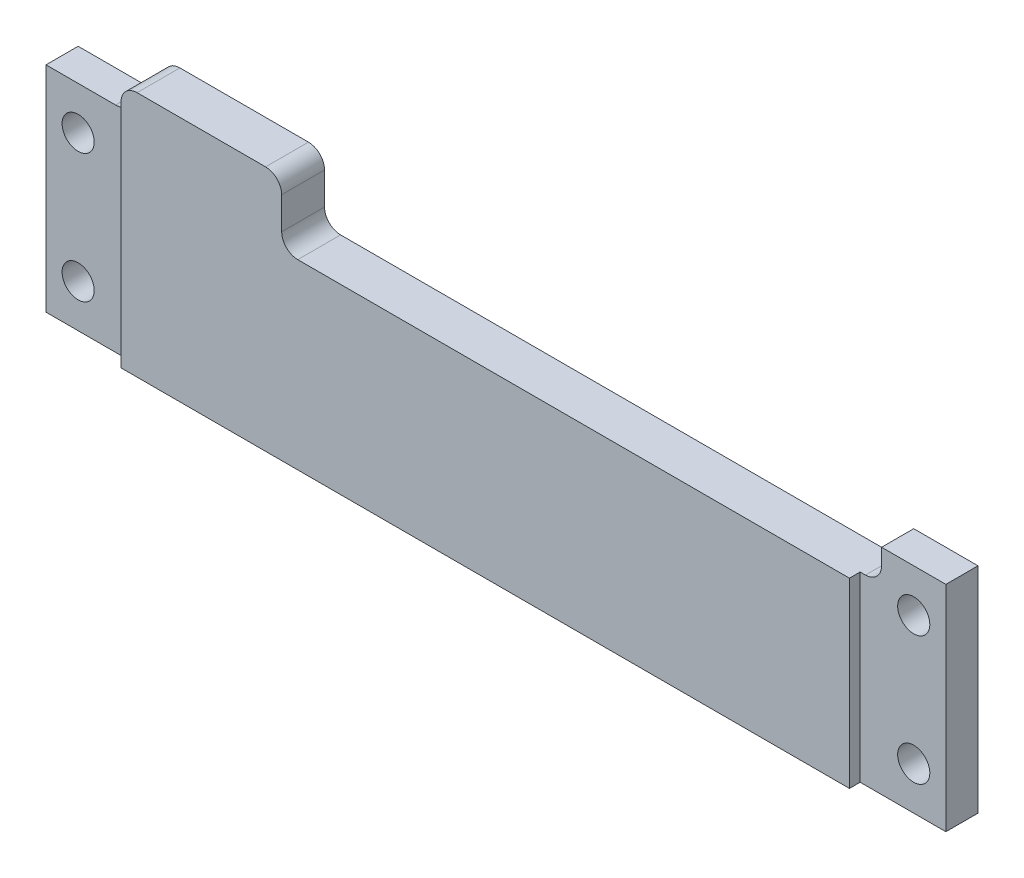
ISO-10303-21;
HEADER;
FILE_DESCRIPTION(('STEP AP214'),'2;1');
FILE_NAME('part.step','',(''),(''),'','','');
FILE_SCHEMA(('AUTOMOTIVE_DESIGN { 1 0 10303 214 1 1 1 1 }'));
ENDSEC;
DATA;
#1=APPLICATION_CONTEXT('core data for automotive mechanical design processes');
#2=APPLICATION_PROTOCOL_DEFINITION('international standard','automotive_design',2000,#1);
#3=PRODUCT_CONTEXT('',#1,'mechanical');
#4=PRODUCT('Part','Part','',(#3));
#5=PRODUCT_RELATED_PRODUCT_CATEGORY('part','',(#4));
#6=PRODUCT_DEFINITION_FORMATION('','',#4);
#7=PRODUCT_DEFINITION_CONTEXT('part definition',#1,'design');
#8=PRODUCT_DEFINITION('design','',#6,#7);
#9=PRODUCT_DEFINITION_SHAPE('','',#8);
#10=(LENGTH_UNIT() NAMED_UNIT(*) SI_UNIT(.MILLI.,.METRE.));
#11=(NAMED_UNIT(*) PLANE_ANGLE_UNIT() SI_UNIT($,.RADIAN.));
#12=(NAMED_UNIT(*) SI_UNIT($,.STERADIAN.) SOLID_ANGLE_UNIT());
#13=UNCERTAINTY_MEASURE_WITH_UNIT(LENGTH_MEASURE(1.E-05),#10,'distance_accuracy_value','');
#14=(GEOMETRIC_REPRESENTATION_CONTEXT(3) GLOBAL_UNCERTAINTY_ASSIGNED_CONTEXT((#13)) GLOBAL_UNIT_ASSIGNED_CONTEXT((#10,
#11,#12)) REPRESENTATION_CONTEXT('',''));
#15=CARTESIAN_POINT('',(0.,0.,0.));
#16=DIRECTION('',(0.,0.,1.));
#17=DIRECTION('',(1.,0.,0.));
#18=AXIS2_PLACEMENT_3D('',#15,#16,#17);
#19=CARTESIAN_POINT('',(0.,20.,4.));
#20=DIRECTION('',(1.,0.,0.));
#21=DIRECTION('',(0.,0.,-1.));
#22=AXIS2_PLACEMENT_3D('',#19,#20,#21);
#23=PLANE('',#22);
#24=DIRECTION('',(0.,-1.,0.));
#25=VECTOR('',#24,1.);
#26=CARTESIAN_POINT('',(0.,20.,3.));
#27=LINE('',#26,#25);
#28=CARTESIAN_POINT('',(0.,20.,3.));
#29=VERTEX_POINT('',#28);
#30=CARTESIAN_POINT('',(0.,0.,3.));
#31=VERTEX_POINT('',#30);
#32=EDGE_CURVE('E191',#29,#31,#27,.T.);
#33=ORIENTED_EDGE('',*,*,#32,.F.);
#34=DIRECTION('',(0.,0.,-1.));
#35=VECTOR('',#34,1.);
#36=CARTESIAN_POINT('',(0.,20.,4.));
#37=LINE('',#36,#35);
#38=CARTESIAN_POINT('',(0.,20.,0.));
#39=VERTEX_POINT('',#38);
#40=EDGE_CURVE('E232',#29,#39,#37,.T.);
#41=ORIENTED_EDGE('',*,*,#40,.T.);
#42=DIRECTION('',(0.,-1.,0.));
#43=VECTOR('',#42,1.);
#44=CARTESIAN_POINT('',(0.,20.,0.));
#45=LINE('',#44,#43);
#46=CARTESIAN_POINT('',(0.,0.,0.));
#47=VERTEX_POINT('',#46);
#48=EDGE_CURVE('E217',#39,#47,#45,.T.);
#49=ORIENTED_EDGE('',*,*,#48,.T.);
#50=DIRECTION('',(0.,0.,-1.));
#51=VECTOR('',#50,1.);
#52=CARTESIAN_POINT('',(0.,0.,4.));
#53=LINE('',#52,#51);
#54=EDGE_CURVE('E263',#31,#47,#53,.T.);
#55=ORIENTED_EDGE('',*,*,#54,.F.);
#56=EDGE_LOOP('',(#33,#41,#49,#55));
#57=FACE_BOUND('',#56,.T.);
#58=ADVANCED_FACE('F33',(#57),#23,.F.);
#59=CARTESIAN_POINT('',(8.,20.,4.));
#60=DIRECTION('',(0.,-1.,0.));
#61=DIRECTION('',(1.,0.,0.));
#62=AXIS2_PLACEMENT_3D('',#59,#60,#61);
#63=PLANE('',#62);
#64=DIRECTION('',(-1.,0.,0.));
#65=VECTOR('',#64,1.);
#66=CARTESIAN_POINT('',(0.,20.,3.));
#67=LINE('',#66,#65);
#68=CARTESIAN_POINT('',(6.5,20.,3.));
#69=VERTEX_POINT('',#68);
#70=EDGE_CURVE('E196',#69,#29,#67,.T.);
#71=ORIENTED_EDGE('',*,*,#70,.F.);
#72=DIRECTION('',(0.,0.,-1.));
#73=VECTOR('',#72,1.);
#74=CARTESIAN_POINT('',(6.5,20.,0.));
#75=LINE('',#74,#73);
#76=CARTESIAN_POINT('',(6.5,20.,0.));
#77=VERTEX_POINT('',#76);
#78=EDGE_CURVE('E299',#69,#77,#75,.T.);
#79=ORIENTED_EDGE('',*,*,#78,.T.);
#80=DIRECTION('',(-1.,0.,0.));
#81=VECTOR('',#80,1.);
#82=CARTESIAN_POINT('',(8.,20.,0.));
#83=LINE('',#82,#81);
#84=EDGE_CURVE('E221',#77,#39,#83,.T.);
#85=ORIENTED_EDGE('',*,*,#84,.T.);
#86=ORIENTED_EDGE('',*,*,#40,.F.);
#87=EDGE_LOOP('',(#71,#79,#85,#86));
#88=FACE_BOUND('',#87,.T.);
#89=ADVANCED_FACE('F375',(#88),#63,.F.);
#90=CARTESIAN_POINT('',(3.,4.,4.));
#91=DIRECTION('',(0.,0.,-1.));
#92=DIRECTION('',(-1.,0.,0.));
#93=AXIS2_PLACEMENT_3D('',#90,#91,#92);
#94=CYLINDRICAL_SURFACE('',#93,1.5);
#95=CARTESIAN_POINT('',(3.,4.,0.));
#96=DIRECTION('',(0.,0.,1.));
#97=DIRECTION('',(1.,0.,0.));
#98=AXIS2_PLACEMENT_3D('',#95,#96,#97);
#99=CIRCLE('',#98,1.5);
#100=CARTESIAN_POINT('',(4.5,4.,0.));
#101=VERTEX_POINT('',#100);
#102=EDGE_CURVE('E214',#101,#101,#99,.T.);
#103=ORIENTED_EDGE('',*,*,#102,.F.);
#104=EDGE_LOOP('',(#103));
#105=FACE_BOUND('',#104,.T.);
#106=CARTESIAN_POINT('',(3.,4.,3.));
#107=DIRECTION('',(0.,0.,1.));
#108=DIRECTION('',(1.,0.,0.));
#109=AXIS2_PLACEMENT_3D('',#106,#107,#108);
#110=CIRCLE('',#109,1.5);
#111=CARTESIAN_POINT('',(4.5,4.,3.));
#112=VERTEX_POINT('',#111);
#113=EDGE_CURVE('E202',#112,#112,#110,.T.);
#114=ORIENTED_EDGE('',*,*,#113,.T.);
#115=EDGE_LOOP('',(#114));
#116=FACE_BOUND('',#115,.T.);
#117=ADVANCED_FACE('F396',(#105,#116),#94,.F.);
#118=CARTESIAN_POINT('',(3.,16.,4.));
#119=DIRECTION('',(0.,0.,-1.));
#120=DIRECTION('',(-1.,0.,0.));
#121=AXIS2_PLACEMENT_3D('',#118,#119,#120);
#122=CYLINDRICAL_SURFACE('',#121,1.5);
#123=CARTESIAN_POINT('',(3.,16.,0.));
#124=DIRECTION('',(0.,0.,1.));
#125=DIRECTION('',(1.,0.,0.));
#126=AXIS2_PLACEMENT_3D('',#123,#124,#125);
#127=CIRCLE('',#126,1.5);
#128=CARTESIAN_POINT('',(4.5,16.,0.));
#129=VERTEX_POINT('',#128);
#130=EDGE_CURVE('E208',#129,#129,#127,.T.);
#131=ORIENTED_EDGE('',*,*,#130,.F.);
#132=EDGE_LOOP('',(#131));
#133=FACE_BOUND('',#132,.T.);
#134=CARTESIAN_POINT('',(3.,16.,3.));
#135=DIRECTION('',(0.,0.,1.));
#136=DIRECTION('',(1.,0.,0.));
#137=AXIS2_PLACEMENT_3D('',#134,#135,#136);
#138=CIRCLE('',#137,1.5);
#139=CARTESIAN_POINT('',(4.5,16.,3.));
#140=VERTEX_POINT('',#139);
#141=EDGE_CURVE('E201',#140,#140,#138,.T.);
#142=ORIENTED_EDGE('',*,*,#141,.T.);
#143=EDGE_LOOP('',(#142));
#144=FACE_BOUND('',#143,.T.);
#145=ADVANCED_FACE('F487',(#133,#144),#122,.F.);
#146=CARTESIAN_POINT('',(0.,0.,4.));
#147=DIRECTION('',(0.,0.,1.));
#148=DIRECTION('',(1.,0.,0.));
#149=AXIS2_PLACEMENT_3D('',#146,#147,#148);
#150=PLANE('',#149);
#151=DIRECTION('',(0.,1.,0.));
#152=VECTOR('',#151,1.);
#153=CARTESIAN_POINT('',(23.,23.,4.));
#154=LINE('',#153,#152);
#155=CARTESIAN_POINT('',(23.,18.5,4.));
#156=VERTEX_POINT('',#155);
#157=CARTESIAN_POINT('',(23.,21.5,4.));
#158=VERTEX_POINT('',#157);
#159=EDGE_CURVE('E224',#156,#158,#154,.T.);
#160=ORIENTED_EDGE('',*,*,#159,.T.);
#161=CARTESIAN_POINT('',(21.5,21.5,4.));
#162=DIRECTION('',(0.,0.,1.));
#163=DIRECTION('',(1.,0.,0.));
#164=AXIS2_PLACEMENT_3D('',#161,#162,#163);
#165=CIRCLE('',#164,1.5);
#166=CARTESIAN_POINT('',(21.5,23.,4.));
#167=VERTEX_POINT('',#166);
#168=EDGE_CURVE('E294',#158,#167,#165,.T.);
#169=ORIENTED_EDGE('',*,*,#168,.T.);
#170=DIRECTION('',(-1.,0.,0.));
#171=VECTOR('',#170,1.);
#172=CARTESIAN_POINT('',(23.,23.,4.));
#173=LINE('',#172,#171);
#174=CARTESIAN_POINT('',(9.5,23.,4.));
#175=VERTEX_POINT('',#174);
#176=EDGE_CURVE('E227',#167,#175,#173,.T.);
#177=ORIENTED_EDGE('',*,*,#176,.T.);
#178=CARTESIAN_POINT('',(9.5,21.5,4.));
#179=DIRECTION('',(0.,0.,1.));
#180=DIRECTION('',(1.,0.,0.));
#181=AXIS2_PLACEMENT_3D('',#178,#179,#180);
#182=CIRCLE('',#181,1.5);
#183=CARTESIAN_POINT('',(8.,21.5,4.));
#184=VERTEX_POINT('',#183);
#185=EDGE_CURVE('E292',#175,#184,#182,.T.);
#186=ORIENTED_EDGE('',*,*,#185,.T.);
#187=DIRECTION('',(0.,-1.,0.));
#188=VECTOR('',#187,1.);
#189=CARTESIAN_POINT('',(8.,23.,4.));
#190=LINE('',#189,#188);
#191=CARTESIAN_POINT('',(8.,0.,4.));
#192=VERTEX_POINT('',#191);
#193=EDGE_CURVE('E230',#184,#192,#190,.T.);
#194=ORIENTED_EDGE('',*,*,#193,.T.);
#195=DIRECTION('',(1.,0.,0.));
#196=VECTOR('',#195,1.);
#197=CARTESIAN_POINT('',(0.,0.,4.));
#198=LINE('',#197,#196);
#199=CARTESIAN_POINT('',(76.,0.,4.));
#200=VERTEX_POINT('',#199);
#201=EDGE_CURVE('E218',#192,#200,#198,.T.);
#202=ORIENTED_EDGE('',*,*,#201,.T.);
#203=DIRECTION('',(0.,-1.,0.));
#204=VECTOR('',#203,1.);
#205=CARTESIAN_POINT('',(76.,0.,4.));
#206=LINE('',#205,#204);
#207=CARTESIAN_POINT('',(76.,17.,4.));
#208=VERTEX_POINT('',#207);
#209=EDGE_CURVE('E162',#208,#200,#206,.T.);
#210=ORIENTED_EDGE('',*,*,#209,.F.);
#211=DIRECTION('',(-1.,0.,0.));
#212=VECTOR('',#211,1.);
#213=CARTESIAN_POINT('',(23.,17.,4.));
#214=LINE('',#213,#212);
#215=CARTESIAN_POINT('',(24.5,17.,4.));
#216=VERTEX_POINT('',#215);
#217=EDGE_CURVE('E220',#208,#216,#214,.T.);
#218=ORIENTED_EDGE('',*,*,#217,.T.);
#219=CARTESIAN_POINT('',(24.5,18.5,4.));
#220=DIRECTION('',(0.,0.,1.));
#221=DIRECTION('',(1.,0.,0.));
#222=AXIS2_PLACEMENT_3D('',#219,#220,#221);
#223=CIRCLE('',#222,1.5);
#224=EDGE_CURVE('E307',#216,#156,#223,.F.);
#225=ORIENTED_EDGE('',*,*,#224,.T.);
#226=EDGE_LOOP('',(#160,#169,#177,#186,#194,#202,#210,#218,#225));
#227=FACE_BOUND('',#226,.T.);
#228=ADVANCED_FACE('F330',(#227),#150,.T.);
#229=CARTESIAN_POINT('',(0.,0.,0.));
#230=DIRECTION('',(0.,0.,1.));
#231=DIRECTION('',(1.,0.,0.));
#232=AXIS2_PLACEMENT_3D('',#229,#230,#231);
#233=PLANE('',#232);
#234=ORIENTED_EDGE('',*,*,#130,.T.);
#235=EDGE_LOOP('',(#234));
#236=FACE_BOUND('',#235,.T.);
#237=ORIENTED_EDGE('',*,*,#102,.T.);
#238=EDGE_LOOP('',(#237));
#239=FACE_BOUND('',#238,.T.);
#240=DIRECTION('',(-1.,0.,0.));
#241=VECTOR('',#240,1.);
#242=CARTESIAN_POINT('',(23.,23.,0.));
#243=LINE('',#242,#241);
#244=CARTESIAN_POINT('',(21.5,23.,0.));
#245=VERTEX_POINT('',#244);
#246=CARTESIAN_POINT('',(9.5,23.,0.));
#247=VERTEX_POINT('',#246);
#248=EDGE_CURVE('E252',#245,#247,#243,.T.);
#249=ORIENTED_EDGE('',*,*,#248,.F.);
#250=CARTESIAN_POINT('',(21.5,21.5,0.));
#251=DIRECTION('',(0.,0.,1.));
#252=DIRECTION('',(1.,0.,0.));
#253=AXIS2_PLACEMENT_3D('',#250,#251,#252);
#254=CIRCLE('',#253,1.5);
#255=CARTESIAN_POINT('',(23.,21.5,0.));
#256=VERTEX_POINT('',#255);
#257=EDGE_CURVE('E290',#245,#256,#254,.F.);
#258=ORIENTED_EDGE('',*,*,#257,.T.);
#259=DIRECTION('',(0.,1.,0.));
#260=VECTOR('',#259,1.);
#261=CARTESIAN_POINT('',(23.,23.,0.));
#262=LINE('',#261,#260);
#263=CARTESIAN_POINT('',(23.,18.5,0.));
#264=VERTEX_POINT('',#263);
#265=EDGE_CURVE('E249',#264,#256,#262,.T.);
#266=ORIENTED_EDGE('',*,*,#265,.F.);
#267=CARTESIAN_POINT('',(24.5,18.5,0.));
#268=DIRECTION('',(0.,0.,1.));
#269=DIRECTION('',(1.,0.,0.));
#270=AXIS2_PLACEMENT_3D('',#267,#268,#269);
#271=CIRCLE('',#270,1.5);
#272=CARTESIAN_POINT('',(24.5,17.,0.));
#273=VERTEX_POINT('',#272);
#274=EDGE_CURVE('E305',#264,#273,#271,.T.);
#275=ORIENTED_EDGE('',*,*,#274,.T.);
#276=DIRECTION('',(-1.,0.,0.));
#277=VECTOR('',#276,1.);
#278=CARTESIAN_POINT('',(23.,17.,0.));
#279=LINE('',#278,#277);
#280=CARTESIAN_POINT('',(76.5,17.,0.));
#281=VERTEX_POINT('',#280);
#282=EDGE_CURVE('E246',#281,#273,#279,.T.);
#283=ORIENTED_EDGE('',*,*,#282,.F.);
#284=CARTESIAN_POINT('',(76.5,18.5,0.));
#285=DIRECTION('',(0.,0.,1.));
#286=DIRECTION('',(1.,0.,0.));
#287=AXIS2_PLACEMENT_3D('',#284,#285,#286);
#288=CIRCLE('',#287,1.5);
#289=CARTESIAN_POINT('',(78.,18.5,0.));
#290=VERTEX_POINT('',#289);
#291=EDGE_CURVE('E301',#281,#290,#288,.T.);
#292=ORIENTED_EDGE('',*,*,#291,.T.);
#293=DIRECTION('',(0.,-1.,0.));
#294=VECTOR('',#293,1.);
#295=CARTESIAN_POINT('',(78.,17.,0.));
#296=LINE('',#295,#294);
#297=CARTESIAN_POINT('',(78.,20.,0.));
#298=VERTEX_POINT('',#297);
#299=EDGE_CURVE('E243',#298,#290,#296,.T.);
#300=ORIENTED_EDGE('',*,*,#299,.F.);
#301=DIRECTION('',(-1.,0.,0.));
#302=VECTOR('',#301,1.);
#303=CARTESIAN_POINT('',(78.,20.,0.));
#304=LINE('',#303,#302);
#305=CARTESIAN_POINT('',(84.,20.,0.));
#306=VERTEX_POINT('',#305);
#307=EDGE_CURVE('E240',#306,#298,#304,.T.);
#308=ORIENTED_EDGE('',*,*,#307,.F.);
#309=DIRECTION('',(0.,1.,0.));
#310=VECTOR('',#309,1.);
#311=CARTESIAN_POINT('',(84.,0.,0.));
#312=LINE('',#311,#310);
#313=CARTESIAN_POINT('',(84.,0.,0.));
#314=VERTEX_POINT('',#313);
#315=EDGE_CURVE('E237',#314,#306,#312,.T.);
#316=ORIENTED_EDGE('',*,*,#315,.F.);
#317=DIRECTION('',(1.,0.,0.));
#318=VECTOR('',#317,1.);
#319=CARTESIAN_POINT('',(0.,0.,0.));
#320=LINE('',#319,#318);
#321=EDGE_CURVE('E235',#47,#314,#320,.T.);
#322=ORIENTED_EDGE('',*,*,#321,.F.);
#323=ORIENTED_EDGE('',*,*,#48,.F.);
#324=ORIENTED_EDGE('',*,*,#84,.F.);
#325=CARTESIAN_POINT('',(6.5,21.5,0.));
#326=DIRECTION('',(0.,0.,1.));
#327=DIRECTION('',(1.,0.,0.));
#328=AXIS2_PLACEMENT_3D('',#325,#326,#327);
#329=CIRCLE('',#328,1.5);
#330=CARTESIAN_POINT('',(8.,21.5,0.));
#331=VERTEX_POINT('',#330);
#332=EDGE_CURVE('E42',#77,#331,#329,.T.);
#333=ORIENTED_EDGE('',*,*,#332,.T.);
#334=CARTESIAN_POINT('',(9.5,21.5,0.));
#335=DIRECTION('',(0.,0.,1.));
#336=DIRECTION('',(1.,0.,0.));
#337=AXIS2_PLACEMENT_3D('',#334,#335,#336);
#338=CIRCLE('',#337,1.5);
#339=EDGE_CURVE('E288',#331,#247,#338,.F.);
#340=ORIENTED_EDGE('',*,*,#339,.T.);
#341=EDGE_LOOP('',(#249,#258,#266,#275,#283,#292,#300,#308,#316,#322,#323,#324,#333,#340));
#342=FACE_BOUND('',#341,.T.);
#343=CARTESIAN_POINT('',(81.,4.,0.));
#344=DIRECTION('',(0.,0.,1.));
#345=DIRECTION('',(1.,0.,0.));
#346=AXIS2_PLACEMENT_3D('',#343,#344,#345);
#347=CIRCLE('',#346,1.5);
#348=CARTESIAN_POINT('',(82.5,4.,0.));
#349=VERTEX_POINT('',#348);
#350=EDGE_CURVE('E211',#349,#349,#347,.T.);
#351=ORIENTED_EDGE('',*,*,#350,.T.);
#352=EDGE_LOOP('',(#351));
#353=FACE_BOUND('',#352,.T.);
#354=CARTESIAN_POINT('',(81.,16.,0.));
#355=DIRECTION('',(0.,0.,1.));
#356=DIRECTION('',(1.,0.,0.));
#357=AXIS2_PLACEMENT_3D('',#354,#355,#356);
#358=CIRCLE('',#357,1.5);
#359=CARTESIAN_POINT('',(82.5,16.,0.));
#360=VERTEX_POINT('',#359);
#361=EDGE_CURVE('E205',#360,#360,#358,.T.);
#362=ORIENTED_EDGE('',*,*,#361,.T.);
#363=EDGE_LOOP('',(#362));
#364=FACE_BOUND('',#363,.T.);
#365=ADVANCED_FACE('F314',(#236,#239,#342,#353,#364),#233,.F.);
#366=CARTESIAN_POINT('',(0.,0.,4.));
#367=DIRECTION('',(0.,1.,0.));
#368=DIRECTION('',(-1.,0.,0.));
#369=AXIS2_PLACEMENT_3D('',#366,#367,#368);
#370=PLANE('',#369);
#371=DIRECTION('',(1.,0.,0.));
#372=VECTOR('',#371,1.);
#373=CARTESIAN_POINT('',(76.,0.,3.));
#374=LINE('',#373,#372);
#375=CARTESIAN_POINT('',(76.,0.,3.));
#376=VERTEX_POINT('',#375);
#377=CARTESIAN_POINT('',(84.,0.,3.));
#378=VERTEX_POINT('',#377);
#379=EDGE_CURVE('E156',#376,#378,#374,.T.);
#380=ORIENTED_EDGE('',*,*,#379,.F.);
#381=DIRECTION('',(0.,0.,1.));
#382=VECTOR('',#381,1.);
#383=CARTESIAN_POINT('',(76.,0.,3.));
#384=LINE('',#383,#382);
#385=EDGE_CURVE('E165',#376,#200,#384,.T.);
#386=ORIENTED_EDGE('',*,*,#385,.T.);
#387=ORIENTED_EDGE('',*,*,#201,.F.);
#388=DIRECTION('',(0.,0.,1.));
#389=VECTOR('',#388,1.);
#390=CARTESIAN_POINT('',(8.,0.,3.));
#391=LINE('',#390,#389);
#392=CARTESIAN_POINT('',(8.,0.,3.));
#393=VERTEX_POINT('',#392);
#394=EDGE_CURVE('E198',#393,#192,#391,.T.);
#395=ORIENTED_EDGE('',*,*,#394,.F.);
#396=DIRECTION('',(1.,0.,0.));
#397=VECTOR('',#396,1.);
#398=CARTESIAN_POINT('',(0.,0.,3.));
#399=LINE('',#398,#397);
#400=EDGE_CURVE('E193',#31,#393,#399,.T.);
#401=ORIENTED_EDGE('',*,*,#400,.F.);
#402=ORIENTED_EDGE('',*,*,#54,.T.);
#403=ORIENTED_EDGE('',*,*,#321,.T.);
#404=DIRECTION('',(0.,0.,-1.));
#405=VECTOR('',#404,1.);
#406=CARTESIAN_POINT('',(84.,0.,4.));
#407=LINE('',#406,#405);
#408=EDGE_CURVE('E177',#378,#314,#407,.T.);
#409=ORIENTED_EDGE('',*,*,#408,.F.);
#410=EDGE_LOOP('',(#380,#386,#387,#395,#401,#402,#403,#409));
#411=FACE_BOUND('',#410,.T.);
#412=ADVANCED_FACE('F175',(#411),#370,.F.);
#413=CARTESIAN_POINT('',(84.,0.,4.));
#414=DIRECTION('',(-1.,0.,0.));
#415=DIRECTION('',(0.,0.,1.));
#416=AXIS2_PLACEMENT_3D('',#413,#414,#415);
#417=PLANE('',#416);
#418=DIRECTION('',(0.,0.,-1.));
#419=VECTOR('',#418,1.);
#420=CARTESIAN_POINT('',(84.,20.,4.));
#421=LINE('',#420,#419);
#422=CARTESIAN_POINT('',(84.,20.,3.));
#423=VERTEX_POINT('',#422);
#424=EDGE_CURVE('E260',#423,#306,#421,.T.);
#425=ORIENTED_EDGE('',*,*,#424,.F.);
#426=DIRECTION('',(0.,1.,0.));
#427=VECTOR('',#426,1.);
#428=CARTESIAN_POINT('',(84.,0.,3.));
#429=LINE('',#428,#427);
#430=EDGE_CURVE('E178',#378,#423,#429,.T.);
#431=ORIENTED_EDGE('',*,*,#430,.F.);
#432=ORIENTED_EDGE('',*,*,#408,.T.);
#433=ORIENTED_EDGE('',*,*,#315,.T.);
#434=EDGE_LOOP('',(#425,#431,#432,#433));
#435=FACE_BOUND('',#434,.T.);
#436=ADVANCED_FACE('F367',(#435),#417,.F.);
#437=CARTESIAN_POINT('',(78.,20.,4.));
#438=DIRECTION('',(0.,-1.,0.));
#439=DIRECTION('',(0.,0.,-1.));
#440=AXIS2_PLACEMENT_3D('',#437,#438,#439);
#441=PLANE('',#440);
#442=DIRECTION('',(0.,0.,-1.));
#443=VECTOR('',#442,1.);
#444=CARTESIAN_POINT('',(78.,20.,4.));
#445=LINE('',#444,#443);
#446=CARTESIAN_POINT('',(78.,20.,3.));
#447=VERTEX_POINT('',#446);
#448=EDGE_CURVE('E258',#447,#298,#445,.T.);
#449=ORIENTED_EDGE('',*,*,#448,.F.);
#450=DIRECTION('',(-1.,0.,0.));
#451=VECTOR('',#450,1.);
#452=CARTESIAN_POINT('',(76.,20.,3.));
#453=LINE('',#452,#451);
#454=EDGE_CURVE('E172',#423,#447,#453,.T.);
#455=ORIENTED_EDGE('',*,*,#454,.F.);
#456=ORIENTED_EDGE('',*,*,#424,.T.);
#457=ORIENTED_EDGE('',*,*,#307,.T.);
#458=EDGE_LOOP('',(#449,#455,#456,#457));
#459=FACE_BOUND('',#458,.T.);
#460=ADVANCED_FACE('F362',(#459),#441,.F.);
#461=CARTESIAN_POINT('',(78.,17.,4.));
#462=DIRECTION('',(1.,0.,0.));
#463=DIRECTION('',(0.,0.,-1.));
#464=AXIS2_PLACEMENT_3D('',#461,#462,#463);
#465=PLANE('',#464);
#466=ORIENTED_EDGE('',*,*,#299,.T.);
#467=DIRECTION('',(0.,0.,-1.));
#468=VECTOR('',#467,1.);
#469=CARTESIAN_POINT('',(78.,18.5,3.));
#470=LINE('',#469,#468);
#471=CARTESIAN_POINT('',(78.,18.5,3.));
#472=VERTEX_POINT('',#471);
#473=EDGE_CURVE('E276',#290,#472,#470,.F.);
#474=ORIENTED_EDGE('',*,*,#473,.T.);
#475=DIRECTION('',(0.,1.,0.));
#476=VECTOR('',#475,1.);
#477=CARTESIAN_POINT('',(78.,17.,3.));
#478=LINE('',#477,#476);
#479=EDGE_CURVE('E189',#472,#447,#478,.T.);
#480=ORIENTED_EDGE('',*,*,#479,.T.);
#481=ORIENTED_EDGE('',*,*,#448,.T.);
#482=EDGE_LOOP('',(#466,#474,#480,#481));
#483=FACE_BOUND('',#482,.T.);
#484=ADVANCED_FACE('F357',(#483),#465,.F.);
#485=CARTESIAN_POINT('',(23.,17.,4.));
#486=DIRECTION('',(0.,-1.,0.));
#487=DIRECTION('',(0.,0.,-1.));
#488=AXIS2_PLACEMENT_3D('',#485,#486,#487);
#489=PLANE('',#488);
#490=DIRECTION('',(1.,0.,0.));
#491=VECTOR('',#490,1.);
#492=CARTESIAN_POINT('',(23.,17.,3.));
#493=LINE('',#492,#491);
#494=CARTESIAN_POINT('',(76.,17.,3.));
#495=VERTEX_POINT('',#494);
#496=CARTESIAN_POINT('',(76.5,17.,3.));
#497=VERTEX_POINT('',#496);
#498=EDGE_CURVE('E159',#495,#497,#493,.T.);
#499=ORIENTED_EDGE('',*,*,#498,.T.);
#500=DIRECTION('',(0.,0.,-1.));
#501=VECTOR('',#500,1.);
#502=CARTESIAN_POINT('',(76.5,17.,0.));
#503=LINE('',#502,#501);
#504=EDGE_CURVE('E273',#497,#281,#503,.T.);
#505=ORIENTED_EDGE('',*,*,#504,.T.);
#506=ORIENTED_EDGE('',*,*,#282,.T.);
#507=DIRECTION('',(0.,0.,-1.));
#508=VECTOR('',#507,1.);
#509=CARTESIAN_POINT('',(24.5,17.,4.));
#510=LINE('',#509,#508);
#511=EDGE_CURVE('E271',#273,#216,#510,.F.);
#512=ORIENTED_EDGE('',*,*,#511,.T.);
#513=ORIENTED_EDGE('',*,*,#217,.F.);
#514=DIRECTION('',(0.,0.,-1.));
#515=VECTOR('',#514,1.);
#516=CARTESIAN_POINT('',(76.,17.,4.));
#517=LINE('',#516,#515);
#518=EDGE_CURVE('E265',#208,#495,#517,.T.);
#519=ORIENTED_EDGE('',*,*,#518,.T.);
#520=EDGE_LOOP('',(#499,#505,#506,#512,#513,#519));
#521=FACE_BOUND('',#520,.T.);
#522=ADVANCED_FACE('F347',(#521),#489,.F.);
#523=CARTESIAN_POINT('',(23.,23.,4.));
#524=DIRECTION('',(-1.,0.,0.));
#525=DIRECTION('',(0.,0.,1.));
#526=AXIS2_PLACEMENT_3D('',#523,#524,#525);
#527=PLANE('',#526);
#528=ORIENTED_EDGE('',*,*,#159,.F.);
#529=DIRECTION('',(0.,0.,-1.));
#530=VECTOR('',#529,1.);
#531=CARTESIAN_POINT('',(23.,18.5,0.));
#532=LINE('',#531,#530);
#533=EDGE_CURVE('E280',#156,#264,#532,.T.);
#534=ORIENTED_EDGE('',*,*,#533,.T.);
#535=ORIENTED_EDGE('',*,*,#265,.T.);
#536=DIRECTION('',(0.,0.,-1.));
#537=VECTOR('',#536,1.);
#538=CARTESIAN_POINT('',(23.,21.5,4.));
#539=LINE('',#538,#537);
#540=EDGE_CURVE('E278',#256,#158,#539,.F.);
#541=ORIENTED_EDGE('',*,*,#540,.T.);
#542=EDGE_LOOP('',(#528,#534,#535,#541));
#543=FACE_BOUND('',#542,.T.);
#544=ADVANCED_FACE('F339',(#543),#527,.F.);
#545=CARTESIAN_POINT('',(23.,23.,4.));
#546=DIRECTION('',(0.,-1.,0.));
#547=DIRECTION('',(1.,0.,0.));
#548=AXIS2_PLACEMENT_3D('',#545,#546,#547);
#549=PLANE('',#548);
#550=ORIENTED_EDGE('',*,*,#176,.F.);
#551=DIRECTION('',(0.,0.,-1.));
#552=VECTOR('',#551,1.);
#553=CARTESIAN_POINT('',(21.5,23.,4.));
#554=LINE('',#553,#552);
#555=EDGE_CURVE('E285',#167,#245,#554,.T.);
#556=ORIENTED_EDGE('',*,*,#555,.T.);
#557=ORIENTED_EDGE('',*,*,#248,.T.);
#558=DIRECTION('',(0.,0.,-1.));
#559=VECTOR('',#558,1.);
#560=CARTESIAN_POINT('',(9.5,23.,4.));
#561=LINE('',#560,#559);
#562=EDGE_CURVE('E283',#247,#175,#561,.F.);
#563=ORIENTED_EDGE('',*,*,#562,.T.);
#564=EDGE_LOOP('',(#550,#556,#557,#563));
#565=FACE_BOUND('',#564,.T.);
#566=ADVANCED_FACE('F327',(#565),#549,.F.);
#567=CARTESIAN_POINT('',(8.,23.,4.));
#568=DIRECTION('',(1.,0.,0.));
#569=DIRECTION('',(0.,0.,-1.));
#570=AXIS2_PLACEMENT_3D('',#567,#568,#569);
#571=PLANE('',#570);
#572=ORIENTED_EDGE('',*,*,#193,.F.);
#573=DIRECTION('',(0.,0.,-1.));
#574=VECTOR('',#573,1.);
#575=CARTESIAN_POINT('',(8.,21.5,4.));
#576=LINE('',#575,#574);
#577=CARTESIAN_POINT('',(8.,21.5,3.));
#578=VERTEX_POINT('',#577);
#579=EDGE_CURVE('E296',#184,#578,#576,.T.);
#580=ORIENTED_EDGE('',*,*,#579,.T.);
#581=DIRECTION('',(0.,1.,0.));
#582=VECTOR('',#581,1.);
#583=CARTESIAN_POINT('',(8.,20.,3.));
#584=LINE('',#583,#582);
#585=EDGE_CURVE('E52',#393,#578,#584,.T.);
#586=ORIENTED_EDGE('',*,*,#585,.F.);
#587=ORIENTED_EDGE('',*,*,#394,.T.);
#588=EDGE_LOOP('',(#572,#580,#586,#587));
#589=FACE_BOUND('',#588,.T.);
#590=ADVANCED_FACE('F378',(#589),#571,.F.);
#591=CARTESIAN_POINT('',(81.,4.,4.));
#592=DIRECTION('',(0.,0.,-1.));
#593=DIRECTION('',(-1.,0.,0.));
#594=AXIS2_PLACEMENT_3D('',#591,#592,#593);
#595=CYLINDRICAL_SURFACE('',#594,1.5);
#596=CARTESIAN_POINT('',(81.,4.,3.));
#597=DIRECTION('',(0.,0.,-1.));
#598=DIRECTION('',(-1.,0.,0.));
#599=AXIS2_PLACEMENT_3D('',#596,#597,#598);
#600=CIRCLE('',#599,1.5);
#601=CARTESIAN_POINT('',(79.5,4.,3.));
#602=VERTEX_POINT('',#601);
#603=EDGE_CURVE('E185',#602,#602,#600,.T.);
#604=ORIENTED_EDGE('',*,*,#603,.F.);
#605=EDGE_LOOP('',(#604));
#606=FACE_BOUND('',#605,.T.);
#607=ORIENTED_EDGE('',*,*,#350,.F.);
#608=EDGE_LOOP('',(#607));
#609=FACE_BOUND('',#608,.T.);
#610=ADVANCED_FACE('F380',(#606,#609),#595,.F.);
#611=CARTESIAN_POINT('',(81.,16.,4.));
#612=DIRECTION('',(0.,0.,-1.));
#613=DIRECTION('',(-1.,0.,0.));
#614=AXIS2_PLACEMENT_3D('',#611,#612,#613);
#615=CYLINDRICAL_SURFACE('',#614,1.5);
#616=CARTESIAN_POINT('',(81.,16.,3.));
#617=DIRECTION('',(0.,0.,-1.));
#618=DIRECTION('',(-1.,0.,0.));
#619=AXIS2_PLACEMENT_3D('',#616,#617,#618);
#620=CIRCLE('',#619,1.5);
#621=CARTESIAN_POINT('',(79.5,16.,3.));
#622=VERTEX_POINT('',#621);
#623=EDGE_CURVE('E171',#622,#622,#620,.T.);
#624=ORIENTED_EDGE('',*,*,#623,.F.);
#625=EDGE_LOOP('',(#624));
#626=FACE_BOUND('',#625,.T.);
#627=ORIENTED_EDGE('',*,*,#361,.F.);
#628=EDGE_LOOP('',(#627));
#629=FACE_BOUND('',#628,.T.);
#630=ADVANCED_FACE('F386',(#626,#629),#615,.F.);
#631=CARTESIAN_POINT('',(0.,0.,3.));
#632=DIRECTION('',(0.,0.,1.));
#633=DIRECTION('',(1.,0.,0.));
#634=AXIS2_PLACEMENT_3D('',#631,#632,#633);
#635=PLANE('',#634);
#636=ORIENTED_EDGE('',*,*,#113,.F.);
#637=EDGE_LOOP('',(#636));
#638=FACE_BOUND('',#637,.T.);
#639=ORIENTED_EDGE('',*,*,#141,.F.);
#640=EDGE_LOOP('',(#639));
#641=FACE_BOUND('',#640,.T.);
#642=ORIENTED_EDGE('',*,*,#32,.T.);
#643=ORIENTED_EDGE('',*,*,#400,.T.);
#644=ORIENTED_EDGE('',*,*,#585,.T.);
#645=CARTESIAN_POINT('',(6.5,21.5,3.));
#646=DIRECTION('',(0.,0.,1.));
#647=DIRECTION('',(1.,0.,0.));
#648=AXIS2_PLACEMENT_3D('',#645,#646,#647);
#649=CIRCLE('',#648,1.5);
#650=EDGE_CURVE('E11',#578,#69,#649,.F.);
#651=ORIENTED_EDGE('',*,*,#650,.T.);
#652=ORIENTED_EDGE('',*,*,#70,.T.);
#653=EDGE_LOOP('',(#642,#643,#644,#651,#652));
#654=FACE_BOUND('',#653,.T.);
#655=ADVANCED_FACE('F376',(#638,#641,#654),#635,.T.);
#656=CARTESIAN_POINT('',(76.,0.,3.));
#657=DIRECTION('',(-1.,0.,0.));
#658=DIRECTION('',(0.,0.,1.));
#659=AXIS2_PLACEMENT_3D('',#656,#657,#658);
#660=PLANE('',#659);
#661=ORIENTED_EDGE('',*,*,#209,.T.);
#662=ORIENTED_EDGE('',*,*,#385,.F.);
#663=DIRECTION('',(0.,-1.,0.));
#664=VECTOR('',#663,1.);
#665=CARTESIAN_POINT('',(76.,0.,3.));
#666=LINE('',#665,#664);
#667=EDGE_CURVE('E152',#495,#376,#666,.T.);
#668=ORIENTED_EDGE('',*,*,#667,.F.);
#669=ORIENTED_EDGE('',*,*,#518,.F.);
#670=EDGE_LOOP('',(#661,#662,#668,#669));
#671=FACE_BOUND('',#670,.T.);
#672=ADVANCED_FACE('F166',(#671),#660,.F.);
#673=CARTESIAN_POINT('',(0.,0.,3.));
#674=DIRECTION('',(0.,0.,-1.));
#675=DIRECTION('',(-1.,0.,0.));
#676=AXIS2_PLACEMENT_3D('',#673,#674,#675);
#677=PLANE('',#676);
#678=ORIENTED_EDGE('',*,*,#623,.T.);
#679=EDGE_LOOP('',(#678));
#680=FACE_BOUND('',#679,.T.);
#681=ORIENTED_EDGE('',*,*,#603,.T.);
#682=EDGE_LOOP('',(#681));
#683=FACE_BOUND('',#682,.T.);
#684=ORIENTED_EDGE('',*,*,#498,.F.);
#685=ORIENTED_EDGE('',*,*,#667,.T.);
#686=ORIENTED_EDGE('',*,*,#379,.T.);
#687=ORIENTED_EDGE('',*,*,#430,.T.);
#688=ORIENTED_EDGE('',*,*,#454,.T.);
#689=ORIENTED_EDGE('',*,*,#479,.F.);
#690=CARTESIAN_POINT('',(76.5,18.5,3.));
#691=DIRECTION('',(0.,0.,-1.));
#692=DIRECTION('',(-1.,0.,0.));
#693=AXIS2_PLACEMENT_3D('',#690,#691,#692);
#694=CIRCLE('',#693,1.5);
#695=EDGE_CURVE('E303',#472,#497,#694,.T.);
#696=ORIENTED_EDGE('',*,*,#695,.T.);
#697=EDGE_LOOP('',(#684,#685,#686,#687,#688,#689,#696));
#698=FACE_BOUND('',#697,.T.);
#699=ADVANCED_FACE('F154',(#680,#683,#698),#677,.F.);
#700=CARTESIAN_POINT('',(76.5,18.5,4.));
#701=DIRECTION('',(0.,0.,1.));
#702=DIRECTION('',(1.,0.,0.));
#703=AXIS2_PLACEMENT_3D('',#700,#701,#702);
#704=CYLINDRICAL_SURFACE('',#703,1.5);
#705=ORIENTED_EDGE('',*,*,#695,.F.);
#706=ORIENTED_EDGE('',*,*,#473,.F.);
#707=ORIENTED_EDGE('',*,*,#291,.F.);
#708=ORIENTED_EDGE('',*,*,#504,.F.);
#709=EDGE_LOOP('',(#705,#706,#707,#708));
#710=FACE_BOUND('',#709,.T.);
#711=ADVANCED_FACE('F352',(#710),#704,.F.);
#712=CARTESIAN_POINT('',(24.5,18.5,4.));
#713=DIRECTION('',(0.,0.,1.));
#714=DIRECTION('',(1.,0.,0.));
#715=AXIS2_PLACEMENT_3D('',#712,#713,#714);
#716=CYLINDRICAL_SURFACE('',#715,1.5);
#717=ORIENTED_EDGE('',*,*,#224,.F.);
#718=ORIENTED_EDGE('',*,*,#511,.F.);
#719=ORIENTED_EDGE('',*,*,#274,.F.);
#720=ORIENTED_EDGE('',*,*,#533,.F.);
#721=EDGE_LOOP('',(#717,#718,#719,#720));
#722=FACE_BOUND('',#721,.T.);
#723=ADVANCED_FACE('F343',(#722),#716,.F.);
#724=CARTESIAN_POINT('',(21.5,21.5,4.));
#725=DIRECTION('',(0.,0.,-1.));
#726=DIRECTION('',(-1.,0.,0.));
#727=AXIS2_PLACEMENT_3D('',#724,#725,#726);
#728=CYLINDRICAL_SURFACE('',#727,1.5);
#729=ORIENTED_EDGE('',*,*,#168,.F.);
#730=ORIENTED_EDGE('',*,*,#540,.F.);
#731=ORIENTED_EDGE('',*,*,#257,.F.);
#732=ORIENTED_EDGE('',*,*,#555,.F.);
#733=EDGE_LOOP('',(#729,#730,#731,#732));
#734=FACE_BOUND('',#733,.T.);
#735=ADVANCED_FACE('F336',(#734),#728,.T.);
#736=CARTESIAN_POINT('',(6.5,21.5,4.));
#737=DIRECTION('',(0.,0.,1.));
#738=DIRECTION('',(1.,0.,0.));
#739=AXIS2_PLACEMENT_3D('',#736,#737,#738);
#740=CYLINDRICAL_SURFACE('',#739,1.5);
#741=ORIENTED_EDGE('',*,*,#78,.F.);
#742=ORIENTED_EDGE('',*,*,#650,.F.);
#743=DIRECTION('',(0.,0.,-1.));
#744=VECTOR('',#743,1.);
#745=CARTESIAN_POINT('',(8.,21.5,3.));
#746=LINE('',#745,#744);
#747=EDGE_CURVE('E37',#331,#578,#746,.F.);
#748=ORIENTED_EDGE('',*,*,#747,.F.);
#749=ORIENTED_EDGE('',*,*,#332,.F.);
#750=EDGE_LOOP('',(#741,#742,#748,#749));
#751=FACE_BOUND('',#750,.T.);
#752=ADVANCED_FACE('F35',(#751),#740,.F.);
#753=CARTESIAN_POINT('',(9.5,21.5,4.));
#754=DIRECTION('',(0.,0.,-1.));
#755=DIRECTION('',(-1.,0.,0.));
#756=AXIS2_PLACEMENT_3D('',#753,#754,#755);
#757=CYLINDRICAL_SURFACE('',#756,1.5);
#758=ORIENTED_EDGE('',*,*,#185,.F.);
#759=ORIENTED_EDGE('',*,*,#562,.F.);
#760=ORIENTED_EDGE('',*,*,#339,.F.);
#761=ORIENTED_EDGE('',*,*,#747,.T.);
#762=ORIENTED_EDGE('',*,*,#579,.F.);
#763=EDGE_LOOP('',(#758,#759,#760,#761,#762));
#764=FACE_BOUND('',#763,.T.);
#765=ADVANCED_FACE('F324',(#764),#757,.T.);
#766=CLOSED_SHELL('',(#58,#89,#117,#145,#228,#365,#412,#436,#460,#484,#522,#544,#566,#590,#610,
#630,#655,#672,#699,#711,#723,#735,#752,#765));
#767=MANIFOLD_SOLID_BREP('B2',#766);
#768=ADVANCED_BREP_SHAPE_REPRESENTATION('',(#18,#767),#14);
#769=SHAPE_DEFINITION_REPRESENTATION(#9,#768);
ENDSEC;
END-ISO-10303-21;
